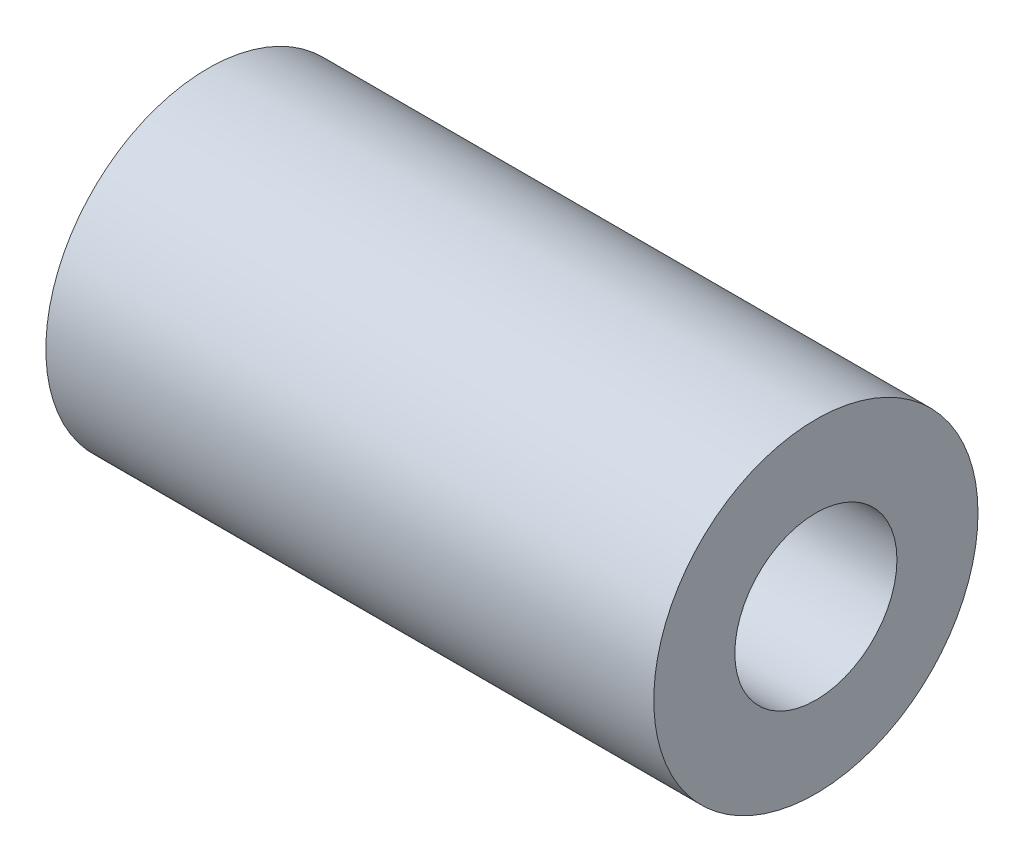
ISO-10303-21;
HEADER;
FILE_DESCRIPTION(('STEP AP214'),'2;1');
FILE_NAME('part.step','',(''),(''),'','','');
FILE_SCHEMA(('AUTOMOTIVE_DESIGN { 1 0 10303 214 1 1 1 1 }'));
ENDSEC;
DATA;
#1=APPLICATION_CONTEXT('core data for automotive mechanical design processes');
#2=APPLICATION_PROTOCOL_DEFINITION('international standard','automotive_design',2000,#1);
#3=PRODUCT_CONTEXT('',#1,'mechanical');
#4=PRODUCT('Part','Part','',(#3));
#5=PRODUCT_RELATED_PRODUCT_CATEGORY('part','',(#4));
#6=PRODUCT_DEFINITION_FORMATION('','',#4);
#7=PRODUCT_DEFINITION_CONTEXT('part definition',#1,'design');
#8=PRODUCT_DEFINITION('design','',#6,#7);
#9=PRODUCT_DEFINITION_SHAPE('','',#8);
#10=(LENGTH_UNIT() NAMED_UNIT(*) SI_UNIT(.MILLI.,.METRE.));
#11=(NAMED_UNIT(*) PLANE_ANGLE_UNIT() SI_UNIT($,.RADIAN.));
#12=(NAMED_UNIT(*) SI_UNIT($,.STERADIAN.) SOLID_ANGLE_UNIT());
#13=UNCERTAINTY_MEASURE_WITH_UNIT(LENGTH_MEASURE(1.E-05),#10,'distance_accuracy_value','');
#14=(GEOMETRIC_REPRESENTATION_CONTEXT(3) GLOBAL_UNCERTAINTY_ASSIGNED_CONTEXT((#13)) GLOBAL_UNIT_ASSIGNED_CONTEXT((#10,
#11,#12)) REPRESENTATION_CONTEXT('',''));
#15=CARTESIAN_POINT('',(0.,0.,0.));
#16=DIRECTION('',(0.,0.,1.));
#17=DIRECTION('',(1.,0.,0.));
#18=AXIS2_PLACEMENT_3D('',#15,#16,#17);
#19=CARTESIAN_POINT('',(15.,0.,0.));
#20=DIRECTION('',(1.,0.,0.));
#21=DIRECTION('',(0.,0.,-1.));
#22=AXIS2_PLACEMENT_3D('',#19,#20,#21);
#23=PLANE('',#22);
#24=CARTESIAN_POINT('',(15.,0.,0.));
#25=DIRECTION('',(1.,0.,0.));
#26=DIRECTION('',(0.,0.,-1.));
#27=AXIS2_PLACEMENT_3D('',#24,#25,#26);
#28=CIRCLE('',#27,4.);
#29=CARTESIAN_POINT('',(15.,0.,-4.));
#30=VERTEX_POINT('',#29);
#31=EDGE_CURVE('E10',#30,#30,#28,.T.);
#32=ORIENTED_EDGE('',*,*,#31,.T.);
#33=EDGE_LOOP('',(#32));
#34=FACE_BOUND('',#33,.T.);
#35=CARTESIAN_POINT('',(15.,0.,0.));
#36=DIRECTION('',(1.,0.,0.));
#37=DIRECTION('',(0.,0.,-1.));
#38=AXIS2_PLACEMENT_3D('',#35,#36,#37);
#39=CIRCLE('',#38,2.);
#40=CARTESIAN_POINT('',(15.,0.,-2.));
#41=VERTEX_POINT('',#40);
#42=EDGE_CURVE('E56',#41,#41,#39,.T.);
#43=ORIENTED_EDGE('',*,*,#42,.F.);
#44=EDGE_LOOP('',(#43));
#45=FACE_BOUND('',#44,.T.);
#46=ADVANCED_FACE('F43',(#34,#45),#23,.T.);
#47=CARTESIAN_POINT('',(0.,0.,0.));
#48=DIRECTION('',(1.,0.,0.));
#49=DIRECTION('',(0.,0.,-1.));
#50=AXIS2_PLACEMENT_3D('',#47,#48,#49);
#51=PLANE('',#50);
#52=CARTESIAN_POINT('',(0.,0.,0.));
#53=DIRECTION('',(1.,0.,0.));
#54=DIRECTION('',(0.,0.,-1.));
#55=AXIS2_PLACEMENT_3D('',#52,#53,#54);
#56=CIRCLE('',#55,4.);
#57=CARTESIAN_POINT('',(0.,0.,-4.));
#58=VERTEX_POINT('',#57);
#59=EDGE_CURVE('E47',#58,#58,#56,.T.);
#60=ORIENTED_EDGE('',*,*,#59,.F.);
#61=EDGE_LOOP('',(#60));
#62=FACE_BOUND('',#61,.T.);
#63=CARTESIAN_POINT('',(0.,0.,0.));
#64=DIRECTION('',(1.,0.,0.));
#65=DIRECTION('',(0.,0.,-1.));
#66=AXIS2_PLACEMENT_3D('',#63,#64,#65);
#67=CIRCLE('',#66,2.);
#68=CARTESIAN_POINT('',(0.,0.,-2.));
#69=VERTEX_POINT('',#68);
#70=EDGE_CURVE('E58',#69,#69,#67,.T.);
#71=ORIENTED_EDGE('',*,*,#70,.T.);
#72=EDGE_LOOP('',(#71));
#73=FACE_BOUND('',#72,.T.);
#74=ADVANCED_FACE('F70',(#62,#73),#51,.F.);
#75=CARTESIAN_POINT('',(15.,0.,0.));
#76=DIRECTION('',(-1.,0.,0.));
#77=DIRECTION('',(0.,0.,1.));
#78=AXIS2_PLACEMENT_3D('',#75,#76,#77);
#79=CYLINDRICAL_SURFACE('',#78,4.);
#80=ORIENTED_EDGE('',*,*,#31,.F.);
#81=EDGE_LOOP('',(#80));
#82=FACE_BOUND('',#81,.T.);
#83=ORIENTED_EDGE('',*,*,#59,.T.);
#84=EDGE_LOOP('',(#83));
#85=FACE_BOUND('',#84,.T.);
#86=ADVANCED_FACE('F45',(#82,#85),#79,.T.);
#87=CARTESIAN_POINT('',(15.,0.,0.));
#88=DIRECTION('',(-1.,0.,0.));
#89=DIRECTION('',(0.,0.,1.));
#90=AXIS2_PLACEMENT_3D('',#87,#88,#89);
#91=CYLINDRICAL_SURFACE('',#90,2.);
#92=ORIENTED_EDGE('',*,*,#42,.T.);
#93=EDGE_LOOP('',(#92));
#94=FACE_BOUND('',#93,.T.);
#95=ORIENTED_EDGE('',*,*,#70,.F.);
#96=EDGE_LOOP('',(#95));
#97=FACE_BOUND('',#96,.T.);
#98=ADVANCED_FACE('F66',(#94,#97),#91,.F.);
#99=CLOSED_SHELL('',(#46,#74,#86,#98));
#100=MANIFOLD_SOLID_BREP('B2',#99);
#101=ADVANCED_BREP_SHAPE_REPRESENTATION('',(#18,#100),#14);
#102=SHAPE_DEFINITION_REPRESENTATION(#9,#101);
ENDSEC;
END-ISO-10303-21;
